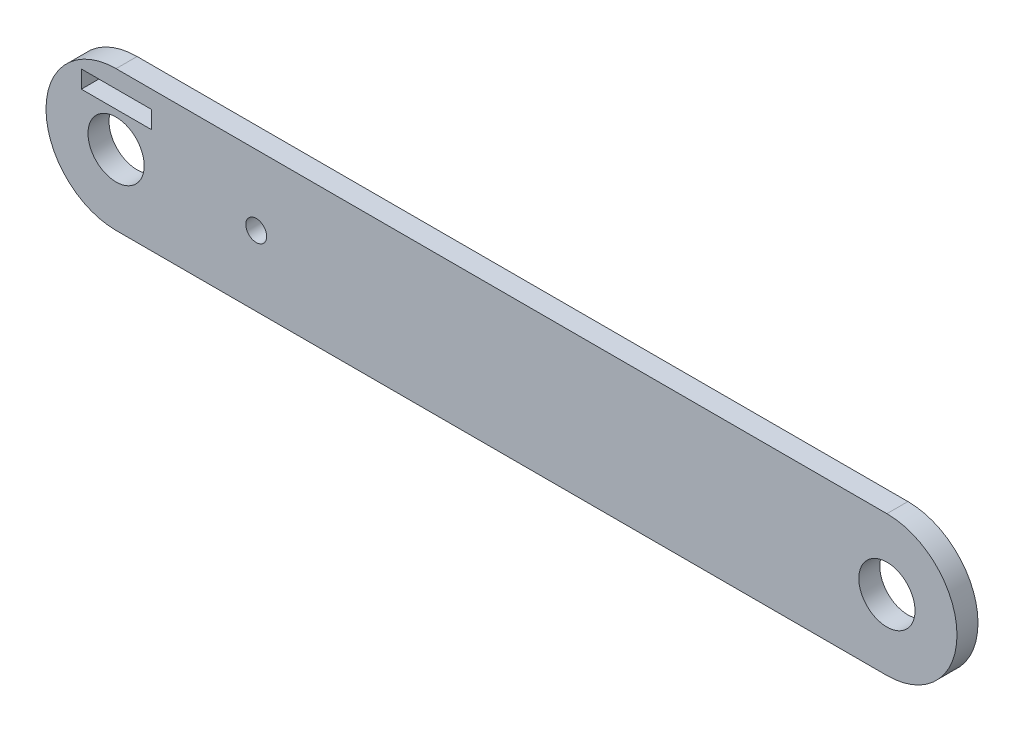
ISO-10303-21;
HEADER;
FILE_DESCRIPTION(('STEP AP214'),'2;1');
FILE_NAME('part.step','',(''),(''),'','','');
FILE_SCHEMA(('AUTOMOTIVE_DESIGN { 1 0 10303 214 1 1 1 1 }'));
ENDSEC;
DATA;
#1=APPLICATION_CONTEXT('core data for automotive mechanical design processes');
#2=APPLICATION_PROTOCOL_DEFINITION('international standard','automotive_design',2000,#1);
#3=PRODUCT_CONTEXT('',#1,'mechanical');
#4=PRODUCT('Part','Part','',(#3));
#5=PRODUCT_RELATED_PRODUCT_CATEGORY('part','',(#4));
#6=PRODUCT_DEFINITION_FORMATION('','',#4);
#7=PRODUCT_DEFINITION_CONTEXT('part definition',#1,'design');
#8=PRODUCT_DEFINITION('design','',#6,#7);
#9=PRODUCT_DEFINITION_SHAPE('','',#8);
#10=(LENGTH_UNIT() NAMED_UNIT(*) SI_UNIT(.MILLI.,.METRE.));
#11=(NAMED_UNIT(*) PLANE_ANGLE_UNIT() SI_UNIT($,.RADIAN.));
#12=(NAMED_UNIT(*) SI_UNIT($,.STERADIAN.) SOLID_ANGLE_UNIT());
#13=UNCERTAINTY_MEASURE_WITH_UNIT(LENGTH_MEASURE(1.E-05),#10,'distance_accuracy_value','');
#14=(GEOMETRIC_REPRESENTATION_CONTEXT(3) GLOBAL_UNCERTAINTY_ASSIGNED_CONTEXT((#13)) GLOBAL_UNIT_ASSIGNED_CONTEXT((#10,
#11,#12)) REPRESENTATION_CONTEXT('',''));
#15=CARTESIAN_POINT('',(0.,0.,0.));
#16=DIRECTION('',(0.,0.,1.));
#17=DIRECTION('',(1.,0.,0.));
#18=AXIS2_PLACEMENT_3D('',#15,#16,#17);
#19=CARTESIAN_POINT('',(0.,0.,3.));
#20=DIRECTION('',(0.,0.,1.));
#21=DIRECTION('',(1.,0.,0.));
#22=AXIS2_PLACEMENT_3D('',#19,#20,#21);
#23=PLANE('',#22);
#24=CARTESIAN_POINT('',(20.,0.,3.));
#25=DIRECTION('',(0.,0.,1.));
#26=DIRECTION('',(1.,0.,0.));
#27=AXIS2_PLACEMENT_3D('',#24,#25,#26);
#28=CIRCLE('',#27,1.49);
#29=CARTESIAN_POINT('',(21.49,0.,3.));
#30=VERTEX_POINT('',#29);
#31=EDGE_CURVE('E357',#30,#30,#28,.T.);
#32=ORIENTED_EDGE('',*,*,#31,.F.);
#33=EDGE_LOOP('',(#32));
#34=FACE_BOUND('',#33,.T.);
#35=CARTESIAN_POINT('',(0.,0.,3.));
#36=DIRECTION('',(0.,0.,1.));
#37=DIRECTION('',(1.,0.,0.));
#38=AXIS2_PLACEMENT_3D('',#35,#36,#37);
#39=CIRCLE('',#38,4.01);
#40=CARTESIAN_POINT('',(4.01,0.,3.));
#41=VERTEX_POINT('',#40);
#42=EDGE_CURVE('E153',#41,#41,#39,.T.);
#43=ORIENTED_EDGE('',*,*,#42,.F.);
#44=EDGE_LOOP('',(#43));
#45=FACE_BOUND('',#44,.T.);
#46=CARTESIAN_POINT('',(0.,0.,3.));
#47=DIRECTION('',(0.,0.,1.));
#48=DIRECTION('',(1.,0.,0.));
#49=AXIS2_PLACEMENT_3D('',#46,#47,#48);
#50=CIRCLE('',#49,10.);
#51=CARTESIAN_POINT('',(0.,10.,3.));
#52=VERTEX_POINT('',#51);
#53=CARTESIAN_POINT('',(0.,-10.,3.));
#54=VERTEX_POINT('',#53);
#55=EDGE_CURVE('E157',#52,#54,#50,.T.);
#56=ORIENTED_EDGE('',*,*,#55,.T.);
#57=DIRECTION('',(1.,0.,0.));
#58=VECTOR('',#57,1.);
#59=CARTESIAN_POINT('',(0.,-10.,3.));
#60=LINE('',#59,#58);
#61=CARTESIAN_POINT('',(110.,-10.0000000000639,3.));
#62=VERTEX_POINT('',#61);
#63=EDGE_CURVE('E162',#54,#62,#60,.T.);
#64=ORIENTED_EDGE('',*,*,#63,.T.);
#65=CARTESIAN_POINT('',(110.,-6.38881308967498E-11,3.));
#66=DIRECTION('',(0.,0.,1.));
#67=DIRECTION('',(1.,0.,0.));
#68=AXIS2_PLACEMENT_3D('',#65,#66,#67);
#69=CIRCLE('',#68,10.0000000000639);
#70=CARTESIAN_POINT('',(110.,10.,3.));
#71=VERTEX_POINT('',#70);
#72=EDGE_CURVE('E165',#62,#71,#69,.T.);
#73=ORIENTED_EDGE('',*,*,#72,.T.);
#74=DIRECTION('',(1.,0.,0.));
#75=VECTOR('',#74,1.);
#76=CARTESIAN_POINT('',(0.,10.,3.));
#77=LINE('',#76,#75);
#78=EDGE_CURVE('E168',#52,#71,#77,.T.);
#79=ORIENTED_EDGE('',*,*,#78,.F.);
#80=EDGE_LOOP('',(#56,#64,#73,#79));
#81=FACE_BOUND('',#80,.T.);
#82=CARTESIAN_POINT('',(110.,-6.38881308967498E-11,3.));
#83=DIRECTION('',(0.,0.,1.));
#84=DIRECTION('',(1.,0.,0.));
#85=AXIS2_PLACEMENT_3D('',#82,#83,#84);
#86=CIRCLE('',#85,4.01);
#87=CARTESIAN_POINT('',(114.01,-6.38881308967498E-11,3.));
#88=VERTEX_POINT('',#87);
#89=EDGE_CURVE('E172',#88,#88,#86,.T.);
#90=ORIENTED_EDGE('',*,*,#89,.F.);
#91=EDGE_LOOP('',(#90));
#92=FACE_BOUND('',#91,.T.);
#93=DIRECTION('',(1.,0.,0.));
#94=VECTOR('',#93,1.);
#95=CARTESIAN_POINT('',(0.,7.48516197188792,3.));
#96=LINE('',#95,#94);
#97=CARTESIAN_POINT('',(-4.9531105439371,7.48516197188792,3.));
#98=VERTEX_POINT('',#97);
#99=CARTESIAN_POINT('',(5.0468894560629,7.48516197188792,3.));
#100=VERTEX_POINT('',#99);
#101=EDGE_CURVE('E127',#98,#100,#96,.T.);
#102=ORIENTED_EDGE('',*,*,#101,.T.);
#103=DIRECTION('',(0.,1.,0.));
#104=VECTOR('',#103,1.);
#105=CARTESIAN_POINT('',(5.0468894560629,0.,3.));
#106=LINE('',#105,#104);
#107=CARTESIAN_POINT('',(5.0468894560629,4.98516197188792,3.));
#108=VERTEX_POINT('',#107);
#109=EDGE_CURVE('E109',#108,#100,#106,.T.);
#110=ORIENTED_EDGE('',*,*,#109,.F.);
#111=DIRECTION('',(1.,0.,0.));
#112=VECTOR('',#111,1.);
#113=CARTESIAN_POINT('',(0.,4.98516197188792,3.));
#114=LINE('',#113,#112);
#115=CARTESIAN_POINT('',(-4.9531105439371,4.98516197188792,3.));
#116=VERTEX_POINT('',#115);
#117=EDGE_CURVE('E119',#116,#108,#114,.T.);
#118=ORIENTED_EDGE('',*,*,#117,.F.);
#119=DIRECTION('',(0.,1.,0.));
#120=VECTOR('',#119,1.);
#121=CARTESIAN_POINT('',(-4.9531105439371,0.,3.));
#122=LINE('',#121,#120);
#123=EDGE_CURVE('E57',#116,#98,#122,.T.);
#124=ORIENTED_EDGE('',*,*,#123,.T.);
#125=EDGE_LOOP('',(#102,#110,#118,#124));
#126=FACE_BOUND('',#125,.T.);
#127=ADVANCED_FACE('F41',(#34,#45,#81,#92,#126),#23,.T.);
#128=CARTESIAN_POINT('',(0.,0.,0.));
#129=DIRECTION('',(0.,0.,1.));
#130=DIRECTION('',(1.,0.,0.));
#131=AXIS2_PLACEMENT_3D('',#128,#129,#130);
#132=PLANE('',#131);
#133=CARTESIAN_POINT('',(20.,0.,0.));
#134=DIRECTION('',(0.,0.,-1.));
#135=DIRECTION('',(-1.,0.,0.));
#136=AXIS2_PLACEMENT_3D('',#133,#134,#135);
#137=CIRCLE('',#136,1.49);
#138=CARTESIAN_POINT('',(18.51,0.,0.));
#139=VERTEX_POINT('',#138);
#140=EDGE_CURVE('E360',#139,#139,#137,.T.);
#141=ORIENTED_EDGE('',*,*,#140,.F.);
#142=EDGE_LOOP('',(#141));
#143=FACE_BOUND('',#142,.T.);
#144=CARTESIAN_POINT('',(110.,-6.38881308967498E-11,0.));
#145=DIRECTION('',(0.,0.,1.));
#146=DIRECTION('',(1.,0.,0.));
#147=AXIS2_PLACEMENT_3D('',#144,#145,#146);
#148=CIRCLE('',#147,4.01);
#149=CARTESIAN_POINT('',(114.01,-6.38881308967498E-11,0.));
#150=VERTEX_POINT('',#149);
#151=EDGE_CURVE('E158',#150,#150,#148,.T.);
#152=ORIENTED_EDGE('',*,*,#151,.T.);
#153=EDGE_LOOP('',(#152));
#154=FACE_BOUND('',#153,.T.);
#155=CARTESIAN_POINT('',(0.,0.,0.));
#156=DIRECTION('',(0.,0.,1.));
#157=DIRECTION('',(1.,0.,0.));
#158=AXIS2_PLACEMENT_3D('',#155,#156,#157);
#159=CIRCLE('',#158,10.);
#160=CARTESIAN_POINT('',(0.,10.,0.));
#161=VERTEX_POINT('',#160);
#162=CARTESIAN_POINT('',(0.,-10.,0.));
#163=VERTEX_POINT('',#162);
#164=EDGE_CURVE('E180',#161,#163,#159,.T.);
#165=ORIENTED_EDGE('',*,*,#164,.F.);
#166=DIRECTION('',(1.,0.,0.));
#167=VECTOR('',#166,1.);
#168=CARTESIAN_POINT('',(0.,10.,0.));
#169=LINE('',#168,#167);
#170=CARTESIAN_POINT('',(110.,10.,0.));
#171=VERTEX_POINT('',#170);
#172=EDGE_CURVE('E191',#161,#171,#169,.T.);
#173=ORIENTED_EDGE('',*,*,#172,.T.);
#174=CARTESIAN_POINT('',(110.,-6.38881308967498E-11,0.));
#175=DIRECTION('',(0.,0.,1.));
#176=DIRECTION('',(1.,0.,0.));
#177=AXIS2_PLACEMENT_3D('',#174,#175,#176);
#178=CIRCLE('',#177,10.0000000000639);
#179=CARTESIAN_POINT('',(110.,-10.0000000000639,0.));
#180=VERTEX_POINT('',#179);
#181=EDGE_CURVE('E187',#180,#171,#178,.T.);
#182=ORIENTED_EDGE('',*,*,#181,.F.);
#183=DIRECTION('',(1.,0.,0.));
#184=VECTOR('',#183,1.);
#185=CARTESIAN_POINT('',(0.,-10.,0.));
#186=LINE('',#185,#184);
#187=EDGE_CURVE('E184',#163,#180,#186,.T.);
#188=ORIENTED_EDGE('',*,*,#187,.F.);
#189=EDGE_LOOP('',(#165,#173,#182,#188));
#190=FACE_BOUND('',#189,.T.);
#191=CARTESIAN_POINT('',(0.,0.,0.));
#192=DIRECTION('',(0.,0.,1.));
#193=DIRECTION('',(1.,0.,0.));
#194=AXIS2_PLACEMENT_3D('',#191,#192,#193);
#195=CIRCLE('',#194,4.01);
#196=CARTESIAN_POINT('',(4.01,0.,0.));
#197=VERTEX_POINT('',#196);
#198=EDGE_CURVE('E123',#197,#197,#195,.T.);
#199=ORIENTED_EDGE('',*,*,#198,.T.);
#200=EDGE_LOOP('',(#199));
#201=FACE_BOUND('',#200,.T.);
#202=DIRECTION('',(0.,1.,0.));
#203=VECTOR('',#202,1.);
#204=CARTESIAN_POINT('',(5.0468894560629,0.,0.));
#205=LINE('',#204,#203);
#206=CARTESIAN_POINT('',(5.0468894560629,4.98516197188792,0.));
#207=VERTEX_POINT('',#206);
#208=CARTESIAN_POINT('',(5.0468894560629,7.48516197188792,0.));
#209=VERTEX_POINT('',#208);
#210=EDGE_CURVE('E65',#207,#209,#205,.T.);
#211=ORIENTED_EDGE('',*,*,#210,.T.);
#212=DIRECTION('',(1.,0.,0.));
#213=VECTOR('',#212,1.);
#214=CARTESIAN_POINT('',(0.,7.48516197188792,0.));
#215=LINE('',#214,#213);
#216=CARTESIAN_POINT('',(-4.9531105439371,7.48516197188792,0.));
#217=VERTEX_POINT('',#216);
#218=EDGE_CURVE('E116',#217,#209,#215,.T.);
#219=ORIENTED_EDGE('',*,*,#218,.F.);
#220=DIRECTION('',(0.,1.,0.));
#221=VECTOR('',#220,1.);
#222=CARTESIAN_POINT('',(-4.9531105439371,0.,0.));
#223=LINE('',#222,#221);
#224=CARTESIAN_POINT('',(-4.9531105439371,4.98516197188792,0.));
#225=VERTEX_POINT('',#224);
#226=EDGE_CURVE('E139',#225,#217,#223,.T.);
#227=ORIENTED_EDGE('',*,*,#226,.F.);
#228=DIRECTION('',(1.,0.,0.));
#229=VECTOR('',#228,1.);
#230=CARTESIAN_POINT('',(0.,4.98516197188792,0.));
#231=LINE('',#230,#229);
#232=EDGE_CURVE('E132',#225,#207,#231,.T.);
#233=ORIENTED_EDGE('',*,*,#232,.T.);
#234=EDGE_LOOP('',(#211,#219,#227,#233));
#235=FACE_BOUND('',#234,.T.);
#236=ADVANCED_FACE('F213',(#143,#154,#190,#201,#235),#132,.F.);
#237=CARTESIAN_POINT('',(0.,0.,3.));
#238=DIRECTION('',(0.,0.,-1.));
#239=DIRECTION('',(-1.,0.,0.));
#240=AXIS2_PLACEMENT_3D('',#237,#238,#239);
#241=CYLINDRICAL_SURFACE('',#240,10.);
#242=ORIENTED_EDGE('',*,*,#164,.T.);
#243=DIRECTION('',(0.,0.,-1.));
#244=VECTOR('',#243,1.);
#245=CARTESIAN_POINT('',(0.,-10.,3.));
#246=LINE('',#245,#244);
#247=EDGE_CURVE('E11',#54,#163,#246,.T.);
#248=ORIENTED_EDGE('',*,*,#247,.F.);
#249=ORIENTED_EDGE('',*,*,#55,.F.);
#250=DIRECTION('',(0.,0.,-1.));
#251=VECTOR('',#250,1.);
#252=CARTESIAN_POINT('',(0.,10.,3.));
#253=LINE('',#252,#251);
#254=EDGE_CURVE('E176',#52,#161,#253,.T.);
#255=ORIENTED_EDGE('',*,*,#254,.T.);
#256=EDGE_LOOP('',(#242,#248,#249,#255));
#257=FACE_BOUND('',#256,.T.);
#258=ADVANCED_FACE('F225',(#257),#241,.T.);
#259=CARTESIAN_POINT('',(0.,-10.,3.));
#260=DIRECTION('',(0.,1.,0.));
#261=DIRECTION('',(0.,0.,1.));
#262=AXIS2_PLACEMENT_3D('',#259,#260,#261);
#263=PLANE('',#262);
#264=ORIENTED_EDGE('',*,*,#187,.T.);
#265=DIRECTION('',(0.,0.,-1.));
#266=VECTOR('',#265,1.);
#267=CARTESIAN_POINT('',(110.,-10.0000000000639,3.));
#268=LINE('',#267,#266);
#269=EDGE_CURVE('E50',#62,#180,#268,.T.);
#270=ORIENTED_EDGE('',*,*,#269,.F.);
#271=ORIENTED_EDGE('',*,*,#63,.F.);
#272=ORIENTED_EDGE('',*,*,#247,.T.);
#273=EDGE_LOOP('',(#264,#270,#271,#272));
#274=FACE_BOUND('',#273,.T.);
#275=ADVANCED_FACE('F223',(#274),#263,.F.);
#276=CARTESIAN_POINT('',(110.,-6.38881308967498E-11,3.));
#277=DIRECTION('',(0.,0.,-1.));
#278=DIRECTION('',(-1.,0.,0.));
#279=AXIS2_PLACEMENT_3D('',#276,#277,#278);
#280=CYLINDRICAL_SURFACE('',#279,10.0000000000639);
#281=ORIENTED_EDGE('',*,*,#181,.T.);
#282=DIRECTION('',(0.,0.,-1.));
#283=VECTOR('',#282,1.);
#284=CARTESIAN_POINT('',(110.,10.,3.));
#285=LINE('',#284,#283);
#286=EDGE_CURVE('E200',#71,#171,#285,.T.);
#287=ORIENTED_EDGE('',*,*,#286,.F.);
#288=ORIENTED_EDGE('',*,*,#72,.F.);
#289=ORIENTED_EDGE('',*,*,#269,.T.);
#290=EDGE_LOOP('',(#281,#287,#288,#289));
#291=FACE_BOUND('',#290,.T.);
#292=ADVANCED_FACE('F208',(#291),#280,.T.);
#293=CARTESIAN_POINT('',(0.,10.,3.));
#294=DIRECTION('',(0.,1.,0.));
#295=DIRECTION('',(-1.,0.,0.));
#296=AXIS2_PLACEMENT_3D('',#293,#294,#295);
#297=PLANE('',#296);
#298=ORIENTED_EDGE('',*,*,#172,.F.);
#299=ORIENTED_EDGE('',*,*,#254,.F.);
#300=ORIENTED_EDGE('',*,*,#78,.T.);
#301=ORIENTED_EDGE('',*,*,#286,.T.);
#302=EDGE_LOOP('',(#298,#299,#300,#301));
#303=FACE_BOUND('',#302,.T.);
#304=ADVANCED_FACE('F217',(#303),#297,.T.);
#305=CARTESIAN_POINT('',(0.,0.,3.));
#306=DIRECTION('',(0.,0.,-1.));
#307=DIRECTION('',(-1.,0.,0.));
#308=AXIS2_PLACEMENT_3D('',#305,#306,#307);
#309=CYLINDRICAL_SURFACE('',#308,4.01);
#310=ORIENTED_EDGE('',*,*,#42,.T.);
#311=EDGE_LOOP('',(#310));
#312=FACE_BOUND('',#311,.T.);
#313=ORIENTED_EDGE('',*,*,#198,.F.);
#314=EDGE_LOOP('',(#313));
#315=FACE_BOUND('',#314,.T.);
#316=ADVANCED_FACE('F43',(#312,#315),#309,.F.);
#317=CARTESIAN_POINT('',(110.,-6.38881308967498E-11,3.));
#318=DIRECTION('',(0.,0.,-1.));
#319=DIRECTION('',(-1.,0.,0.));
#320=AXIS2_PLACEMENT_3D('',#317,#318,#319);
#321=CYLINDRICAL_SURFACE('',#320,4.01);
#322=ORIENTED_EDGE('',*,*,#89,.T.);
#323=EDGE_LOOP('',(#322));
#324=FACE_BOUND('',#323,.T.);
#325=ORIENTED_EDGE('',*,*,#151,.F.);
#326=EDGE_LOOP('',(#325));
#327=FACE_BOUND('',#326,.T.);
#328=ADVANCED_FACE('F244',(#324,#327),#321,.F.);
#329=CARTESIAN_POINT('',(5.0468894560629,0.,3.001));
#330=DIRECTION('',(-1.,0.,0.));
#331=DIRECTION('',(0.,0.,1.));
#332=AXIS2_PLACEMENT_3D('',#329,#330,#331);
#333=PLANE('',#332);
#334=ORIENTED_EDGE('',*,*,#109,.T.);
#335=DIRECTION('',(0.,0.,-1.));
#336=VECTOR('',#335,1.);
#337=CARTESIAN_POINT('',(5.0468894560629,7.48516197188792,3.001));
#338=LINE('',#337,#336);
#339=EDGE_CURVE('E124',#100,#209,#338,.T.);
#340=ORIENTED_EDGE('',*,*,#339,.T.);
#341=ORIENTED_EDGE('',*,*,#210,.F.);
#342=DIRECTION('',(0.,0.,-1.));
#343=VECTOR('',#342,1.);
#344=CARTESIAN_POINT('',(5.0468894560629,4.98516197188792,3.001));
#345=LINE('',#344,#343);
#346=EDGE_CURVE('E105',#108,#207,#345,.T.);
#347=ORIENTED_EDGE('',*,*,#346,.F.);
#348=EDGE_LOOP('',(#334,#340,#341,#347));
#349=FACE_BOUND('',#348,.T.);
#350=ADVANCED_FACE('F107',(#349),#333,.T.);
#351=CARTESIAN_POINT('',(0.,7.48516197188792,3.001));
#352=DIRECTION('',(0.,1.,0.));
#353=DIRECTION('',(-1.,0.,0.));
#354=AXIS2_PLACEMENT_3D('',#351,#352,#353);
#355=PLANE('',#354);
#356=DIRECTION('',(0.,0.,-1.));
#357=VECTOR('',#356,1.);
#358=CARTESIAN_POINT('',(-4.9531105439371,7.48516197188792,3.001));
#359=LINE('',#358,#357);
#360=EDGE_CURVE('E148',#98,#217,#359,.T.);
#361=ORIENTED_EDGE('',*,*,#360,.T.);
#362=ORIENTED_EDGE('',*,*,#218,.T.);
#363=ORIENTED_EDGE('',*,*,#339,.F.);
#364=ORIENTED_EDGE('',*,*,#101,.F.);
#365=EDGE_LOOP('',(#361,#362,#363,#364));
#366=FACE_BOUND('',#365,.T.);
#367=ADVANCED_FACE('F275',(#366),#355,.F.);
#368=CARTESIAN_POINT('',(-4.9531105439371,0.,3.001));
#369=DIRECTION('',(-1.,0.,0.));
#370=DIRECTION('',(0.,0.,1.));
#371=AXIS2_PLACEMENT_3D('',#368,#369,#370);
#372=PLANE('',#371);
#373=DIRECTION('',(0.,0.,-1.));
#374=VECTOR('',#373,1.);
#375=CARTESIAN_POINT('',(-4.9531105439371,4.98516197188792,3.001));
#376=LINE('',#375,#374);
#377=EDGE_CURVE('E115',#116,#225,#376,.T.);
#378=ORIENTED_EDGE('',*,*,#377,.T.);
#379=ORIENTED_EDGE('',*,*,#226,.T.);
#380=ORIENTED_EDGE('',*,*,#360,.F.);
#381=ORIENTED_EDGE('',*,*,#123,.F.);
#382=EDGE_LOOP('',(#378,#379,#380,#381));
#383=FACE_BOUND('',#382,.T.);
#384=ADVANCED_FACE('F281',(#383),#372,.F.);
#385=CARTESIAN_POINT('',(0.,4.98516197188792,3.001));
#386=DIRECTION('',(0.,1.,0.));
#387=DIRECTION('',(-1.,0.,0.));
#388=AXIS2_PLACEMENT_3D('',#385,#386,#387);
#389=PLANE('',#388);
#390=ORIENTED_EDGE('',*,*,#117,.T.);
#391=ORIENTED_EDGE('',*,*,#346,.T.);
#392=ORIENTED_EDGE('',*,*,#232,.F.);
#393=ORIENTED_EDGE('',*,*,#377,.F.);
#394=EDGE_LOOP('',(#390,#391,#392,#393));
#395=FACE_BOUND('',#394,.T.);
#396=ADVANCED_FACE('F120',(#395),#389,.T.);
#397=CARTESIAN_POINT('',(20.,0.,10.));
#398=DIRECTION('',(0.,0.,-1.));
#399=DIRECTION('',(-1.,0.,0.));
#400=AXIS2_PLACEMENT_3D('',#397,#398,#399);
#401=CYLINDRICAL_SURFACE('',#400,1.49);
#402=ORIENTED_EDGE('',*,*,#31,.T.);
#403=EDGE_LOOP('',(#402));
#404=FACE_BOUND('',#403,.T.);
#405=ORIENTED_EDGE('',*,*,#140,.T.);
#406=EDGE_LOOP('',(#405));
#407=FACE_BOUND('',#406,.T.);
#408=ADVANCED_FACE('F295',(#404,#407),#401,.F.);
#409=CLOSED_SHELL('',(#127,#236,#258,#275,#292,#304,#316,#328,#350,#367,#384,#396,#408));
#410=MANIFOLD_SOLID_BREP('B2',#409);
#411=ADVANCED_BREP_SHAPE_REPRESENTATION('',(#18,#410),#14);
#412=SHAPE_DEFINITION_REPRESENTATION(#9,#411);
ENDSEC;
END-ISO-10303-21;
